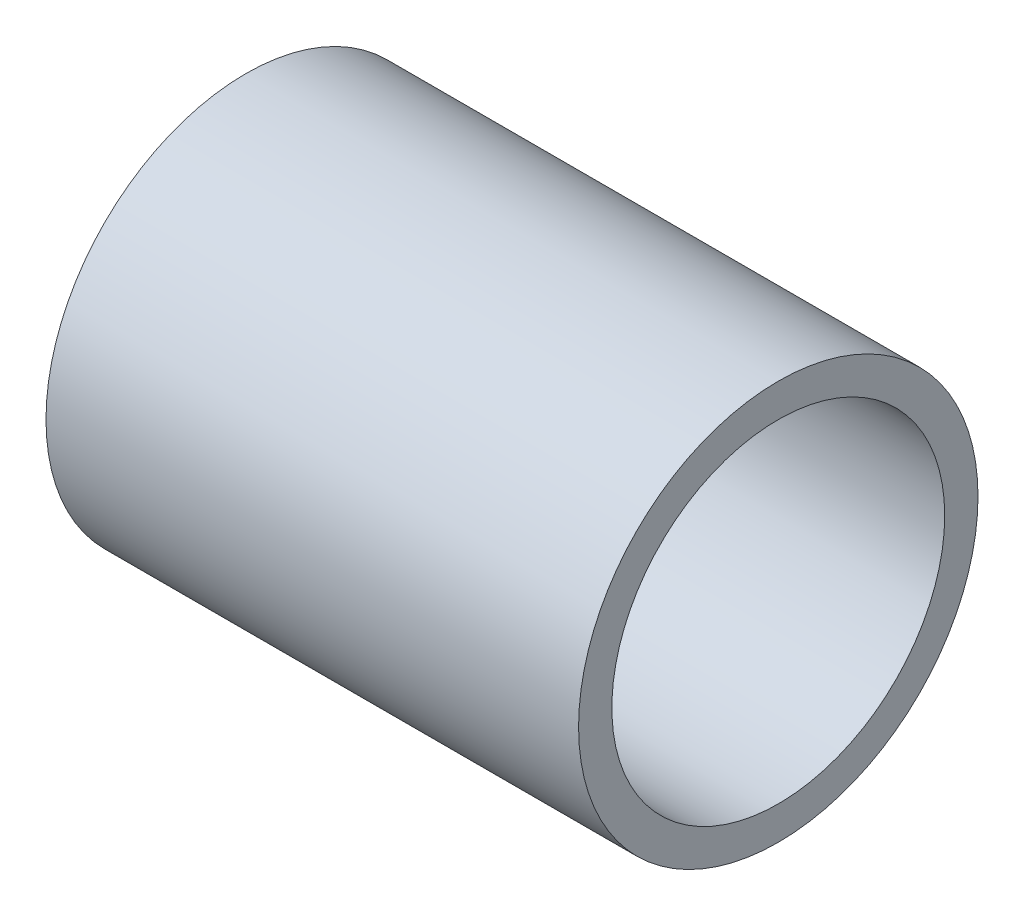
ISO-10303-21;
HEADER;
FILE_DESCRIPTION(('STEP AP214'),'2;1');
FILE_NAME('part.step','',(''),(''),'','','');
FILE_SCHEMA(('AUTOMOTIVE_DESIGN { 1 0 10303 214 1 1 1 1 }'));
ENDSEC;
DATA;
#1=APPLICATION_CONTEXT('core data for automotive mechanical design processes');
#2=APPLICATION_PROTOCOL_DEFINITION('international standard','automotive_design',2000,#1);
#3=PRODUCT_CONTEXT('',#1,'mechanical');
#4=PRODUCT('Part','Part','',(#3));
#5=PRODUCT_RELATED_PRODUCT_CATEGORY('part','',(#4));
#6=PRODUCT_DEFINITION_FORMATION('','',#4);
#7=PRODUCT_DEFINITION_CONTEXT('part definition',#1,'design');
#8=PRODUCT_DEFINITION('design','',#6,#7);
#9=PRODUCT_DEFINITION_SHAPE('','',#8);
#10=(LENGTH_UNIT() NAMED_UNIT(*) SI_UNIT(.MILLI.,.METRE.));
#11=(NAMED_UNIT(*) PLANE_ANGLE_UNIT() SI_UNIT($,.RADIAN.));
#12=(NAMED_UNIT(*) SI_UNIT($,.STERADIAN.) SOLID_ANGLE_UNIT());
#13=UNCERTAINTY_MEASURE_WITH_UNIT(LENGTH_MEASURE(1.E-05),#10,'distance_accuracy_value','');
#14=(GEOMETRIC_REPRESENTATION_CONTEXT(3) GLOBAL_UNCERTAINTY_ASSIGNED_CONTEXT((#13)) GLOBAL_UNIT_ASSIGNED_CONTEXT((#10,
#11,#12)) REPRESENTATION_CONTEXT('',''));
#15=CARTESIAN_POINT('',(0.,0.,0.));
#16=DIRECTION('',(0.,0.,1.));
#17=DIRECTION('',(1.,0.,0.));
#18=AXIS2_PLACEMENT_3D('',#15,#16,#17);
#19=CARTESIAN_POINT('',(-12.7,9.525,0.));
#20=DIRECTION('',(-1.,0.,0.));
#21=DIRECTION('',(0.,0.,1.));
#22=AXIS2_PLACEMENT_3D('',#19,#20,#21);
#23=PLANE('',#22);
#24=CARTESIAN_POINT('',(-12.7,0.,0.));
#25=DIRECTION('',(1.,0.,0.));
#26=DIRECTION('',(0.,0.,-1.));
#27=AXIS2_PLACEMENT_3D('',#24,#25,#26);
#28=CIRCLE('',#27,7.93749999999999);
#29=CARTESIAN_POINT('',(-12.7,0.,-7.93749999999999));
#30=VERTEX_POINT('',#29);
#31=EDGE_CURVE('E10',#30,#30,#28,.T.);
#32=ORIENTED_EDGE('',*,*,#31,.T.);
#33=EDGE_LOOP('',(#32));
#34=FACE_BOUND('',#33,.T.);
#35=CARTESIAN_POINT('',(-12.7,0.,0.));
#36=DIRECTION('',(1.,0.,0.));
#37=DIRECTION('',(0.,0.,-1.));
#38=AXIS2_PLACEMENT_3D('',#35,#36,#37);
#39=CIRCLE('',#38,9.525);
#40=CARTESIAN_POINT('',(-12.7,0.,-9.525));
#41=VERTEX_POINT('',#40);
#42=EDGE_CURVE('E44',#41,#41,#39,.T.);
#43=ORIENTED_EDGE('',*,*,#42,.F.);
#44=EDGE_LOOP('',(#43));
#45=FACE_BOUND('',#44,.T.);
#46=ADVANCED_FACE('F30',(#34,#45),#23,.T.);
#47=CARTESIAN_POINT('',(12.5969669950841,0.,0.));
#48=DIRECTION('',(1.,0.,0.));
#49=DIRECTION('',(0.,0.,-1.));
#50=AXIS2_PLACEMENT_3D('',#47,#48,#49);
#51=CYLINDRICAL_SURFACE('',#50,7.9375);
#52=CARTESIAN_POINT('',(12.7,0.,0.));
#53=DIRECTION('',(1.,0.,0.));
#54=DIRECTION('',(0.,0.,-1.));
#55=AXIS2_PLACEMENT_3D('',#52,#53,#54);
#56=CIRCLE('',#55,7.9375);
#57=CARTESIAN_POINT('',(12.7,0.,-7.9375));
#58=VERTEX_POINT('',#57);
#59=EDGE_CURVE('E36',#58,#58,#56,.T.);
#60=ORIENTED_EDGE('',*,*,#59,.T.);
#61=EDGE_LOOP('',(#60));
#62=FACE_BOUND('',#61,.T.);
#63=ORIENTED_EDGE('',*,*,#31,.F.);
#64=EDGE_LOOP('',(#63));
#65=FACE_BOUND('',#64,.T.);
#66=ADVANCED_FACE('F54',(#62,#65),#51,.F.);
#67=CARTESIAN_POINT('',(12.7,9.525,0.));
#68=DIRECTION('',(1.,0.,0.));
#69=DIRECTION('',(0.,0.,-1.));
#70=AXIS2_PLACEMENT_3D('',#67,#68,#69);
#71=PLANE('',#70);
#72=CARTESIAN_POINT('',(12.7,0.,0.));
#73=DIRECTION('',(1.,0.,0.));
#74=DIRECTION('',(0.,0.,-1.));
#75=AXIS2_PLACEMENT_3D('',#72,#73,#74);
#76=CIRCLE('',#75,9.525);
#77=CARTESIAN_POINT('',(12.7,0.,-9.525));
#78=VERTEX_POINT('',#77);
#79=EDGE_CURVE('E40',#78,#78,#76,.T.);
#80=ORIENTED_EDGE('',*,*,#79,.T.);
#81=EDGE_LOOP('',(#80));
#82=FACE_BOUND('',#81,.T.);
#83=ORIENTED_EDGE('',*,*,#59,.F.);
#84=EDGE_LOOP('',(#83));
#85=FACE_BOUND('',#84,.T.);
#86=ADVANCED_FACE('F58',(#82,#85),#71,.T.);
#87=CARTESIAN_POINT('',(12.5969669950841,0.,0.));
#88=DIRECTION('',(1.,0.,0.));
#89=DIRECTION('',(0.,0.,-1.));
#90=AXIS2_PLACEMENT_3D('',#87,#88,#89);
#91=CYLINDRICAL_SURFACE('',#90,9.525);
#92=ORIENTED_EDGE('',*,*,#42,.T.);
#93=EDGE_LOOP('',(#92));
#94=FACE_BOUND('',#93,.T.);
#95=ORIENTED_EDGE('',*,*,#79,.F.);
#96=EDGE_LOOP('',(#95));
#97=FACE_BOUND('',#96,.T.);
#98=ADVANCED_FACE('F50',(#94,#97),#91,.T.);
#99=CLOSED_SHELL('',(#46,#66,#86,#98));
#100=MANIFOLD_SOLID_BREP('B2',#99);
#101=ADVANCED_BREP_SHAPE_REPRESENTATION('',(#18,#100),#14);
#102=SHAPE_DEFINITION_REPRESENTATION(#9,#101);
ENDSEC;
END-ISO-10303-21;
